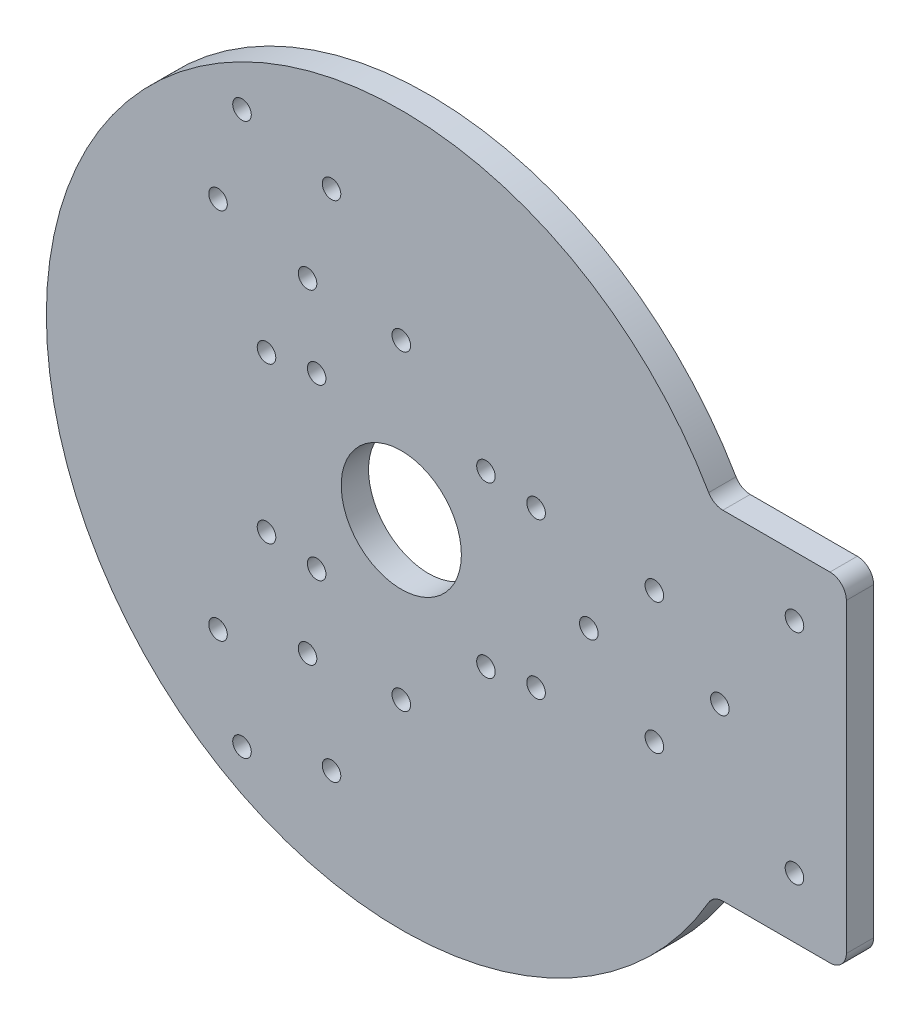
ISO-10303-21;
HEADER;
FILE_DESCRIPTION(('STEP AP214'),'2;1');
FILE_NAME('part.step','',(''),(''),'','','');
FILE_SCHEMA(('AUTOMOTIVE_DESIGN { 1 0 10303 214 1 1 1 1 }'));
ENDSEC;
DATA;
#1=APPLICATION_CONTEXT('core data for automotive mechanical design processes');
#2=APPLICATION_PROTOCOL_DEFINITION('international standard','automotive_design',2000,#1);
#3=PRODUCT_CONTEXT('',#1,'mechanical');
#4=PRODUCT('Part','Part','',(#3));
#5=PRODUCT_RELATED_PRODUCT_CATEGORY('part','',(#4));
#6=PRODUCT_DEFINITION_FORMATION('','',#4);
#7=PRODUCT_DEFINITION_CONTEXT('part definition',#1,'design');
#8=PRODUCT_DEFINITION('design','',#6,#7);
#9=PRODUCT_DEFINITION_SHAPE('','',#8);
#10=(LENGTH_UNIT() NAMED_UNIT(*) SI_UNIT(.MILLI.,.METRE.));
#11=(NAMED_UNIT(*) PLANE_ANGLE_UNIT() SI_UNIT($,.RADIAN.));
#12=(NAMED_UNIT(*) SI_UNIT($,.STERADIAN.) SOLID_ANGLE_UNIT());
#13=UNCERTAINTY_MEASURE_WITH_UNIT(LENGTH_MEASURE(1.E-05),#10,'distance_accuracy_value','');
#14=(GEOMETRIC_REPRESENTATION_CONTEXT(3) GLOBAL_UNCERTAINTY_ASSIGNED_CONTEXT((#13)) GLOBAL_UNIT_ASSIGNED_CONTEXT((#10,
#11,#12)) REPRESENTATION_CONTEXT('',''));
#15=CARTESIAN_POINT('',(0.,0.,0.));
#16=DIRECTION('',(0.,0.,1.));
#17=DIRECTION('',(1.,0.,0.));
#18=AXIS2_PLACEMENT_3D('',#15,#16,#17);
#19=CARTESIAN_POINT('',(78.5,-28.,5.));
#20=DIRECTION('',(0.,0.,-1.));
#21=DIRECTION('',(-1.,0.,0.));
#22=AXIS2_PLACEMENT_3D('',#19,#20,#21);
#23=CYLINDRICAL_SURFACE('',#22,3.);
#24=CARTESIAN_POINT('',(78.5,-28.,0.));
#25=DIRECTION('',(0.,0.,1.));
#26=DIRECTION('',(1.,0.,0.));
#27=AXIS2_PLACEMENT_3D('',#24,#25,#26);
#28=CIRCLE('',#27,3.);
#29=CARTESIAN_POINT('',(78.5,-31.,0.));
#30=VERTEX_POINT('',#29);
#31=CARTESIAN_POINT('',(81.5,-28.,0.));
#32=VERTEX_POINT('',#31);
#33=EDGE_CURVE('E133',#30,#32,#28,.T.);
#34=ORIENTED_EDGE('',*,*,#33,.T.);
#35=DIRECTION('',(0.,0.,-1.));
#36=VECTOR('',#35,1.);
#37=CARTESIAN_POINT('',(81.5,-28.,5.));
#38=LINE('',#37,#36);
#39=CARTESIAN_POINT('',(81.5,-28.,5.));
#40=VERTEX_POINT('',#39);
#41=EDGE_CURVE('E11',#40,#32,#38,.T.);
#42=ORIENTED_EDGE('',*,*,#41,.F.);
#43=CARTESIAN_POINT('',(78.5,-28.,5.));
#44=DIRECTION('',(0.,0.,1.));
#45=DIRECTION('',(1.,0.,0.));
#46=AXIS2_PLACEMENT_3D('',#43,#44,#45);
#47=CIRCLE('',#46,3.);
#48=CARTESIAN_POINT('',(78.5,-31.,5.));
#49=VERTEX_POINT('',#48);
#50=EDGE_CURVE('E148',#49,#40,#47,.T.);
#51=ORIENTED_EDGE('',*,*,#50,.F.);
#52=DIRECTION('',(0.,0.,-1.));
#53=VECTOR('',#52,1.);
#54=CARTESIAN_POINT('',(78.5,-31.,5.));
#55=LINE('',#54,#53);
#56=EDGE_CURVE('E129',#49,#30,#55,.T.);
#57=ORIENTED_EDGE('',*,*,#56,.T.);
#58=EDGE_LOOP('',(#34,#42,#51,#57));
#59=FACE_BOUND('',#58,.T.);
#60=ADVANCED_FACE('F35',(#59),#23,.T.);
#61=CARTESIAN_POINT('',(81.5,-28.,5.));
#62=DIRECTION('',(-1.,0.,0.));
#63=DIRECTION('',(0.,0.,1.));
#64=AXIS2_PLACEMENT_3D('',#61,#62,#63);
#65=PLANE('',#64);
#66=DIRECTION('',(0.,1.,0.));
#67=VECTOR('',#66,1.);
#68=CARTESIAN_POINT('',(81.5,-28.,0.));
#69=LINE('',#68,#67);
#70=CARTESIAN_POINT('',(81.5,28.,0.));
#71=VERTEX_POINT('',#70);
#72=EDGE_CURVE('E136',#32,#71,#69,.T.);
#73=ORIENTED_EDGE('',*,*,#72,.T.);
#74=DIRECTION('',(0.,0.,-1.));
#75=VECTOR('',#74,1.);
#76=CARTESIAN_POINT('',(81.5,28.,5.));
#77=LINE('',#76,#75);
#78=CARTESIAN_POINT('',(81.5,28.,5.));
#79=VERTEX_POINT('',#78);
#80=EDGE_CURVE('E44',#79,#71,#77,.T.);
#81=ORIENTED_EDGE('',*,*,#80,.F.);
#82=DIRECTION('',(0.,1.,0.));
#83=VECTOR('',#82,1.);
#84=CARTESIAN_POINT('',(81.5,-28.,5.));
#85=LINE('',#84,#83);
#86=EDGE_CURVE('E96',#40,#79,#85,.T.);
#87=ORIENTED_EDGE('',*,*,#86,.F.);
#88=ORIENTED_EDGE('',*,*,#41,.T.);
#89=EDGE_LOOP('',(#73,#81,#87,#88));
#90=FACE_BOUND('',#89,.T.);
#91=ADVANCED_FACE('F320',(#90),#65,.F.);
#92=CARTESIAN_POINT('',(78.5,28.,5.));
#93=DIRECTION('',(0.,0.,-1.));
#94=DIRECTION('',(-1.,0.,0.));
#95=AXIS2_PLACEMENT_3D('',#92,#93,#94);
#96=CYLINDRICAL_SURFACE('',#95,3.);
#97=CARTESIAN_POINT('',(78.5,28.,0.));
#98=DIRECTION('',(0.,0.,1.));
#99=DIRECTION('',(1.,0.,0.));
#100=AXIS2_PLACEMENT_3D('',#97,#98,#99);
#101=CIRCLE('',#100,3.);
#102=CARTESIAN_POINT('',(78.5,31.,0.));
#103=VERTEX_POINT('',#102);
#104=EDGE_CURVE('E139',#71,#103,#101,.T.);
#105=ORIENTED_EDGE('',*,*,#104,.T.);
#106=DIRECTION('',(0.,0.,-1.));
#107=VECTOR('',#106,1.);
#108=CARTESIAN_POINT('',(78.5,31.,5.));
#109=LINE('',#108,#107);
#110=CARTESIAN_POINT('',(78.5,31.,5.));
#111=VERTEX_POINT('',#110);
#112=EDGE_CURVE('E155',#111,#103,#109,.T.);
#113=ORIENTED_EDGE('',*,*,#112,.F.);
#114=CARTESIAN_POINT('',(78.5,28.,5.));
#115=DIRECTION('',(0.,0.,1.));
#116=DIRECTION('',(1.,0.,0.));
#117=AXIS2_PLACEMENT_3D('',#114,#115,#116);
#118=CIRCLE('',#117,3.);
#119=EDGE_CURVE('E288',#79,#111,#118,.T.);
#120=ORIENTED_EDGE('',*,*,#119,.F.);
#121=ORIENTED_EDGE('',*,*,#80,.T.);
#122=EDGE_LOOP('',(#105,#113,#120,#121));
#123=FACE_BOUND('',#122,.T.);
#124=ADVANCED_FACE('F324',(#123),#96,.T.);
#125=CARTESIAN_POINT('',(78.5,31.,5.));
#126=DIRECTION('',(0.,-1.,0.));
#127=DIRECTION('',(0.,0.,-1.));
#128=AXIS2_PLACEMENT_3D('',#125,#126,#127);
#129=PLANE('',#128);
#130=DIRECTION('',(-1.,0.,0.));
#131=VECTOR('',#130,1.);
#132=CARTESIAN_POINT('',(78.5,31.,0.));
#133=LINE('',#132,#131);
#134=CARTESIAN_POINT('',(58.8897274573418,31.,0.));
#135=VERTEX_POINT('',#134);
#136=EDGE_CURVE('E141',#103,#135,#133,.T.);
#137=ORIENTED_EDGE('',*,*,#136,.T.);
#138=DIRECTION('',(0.,0.,-1.));
#139=VECTOR('',#138,1.);
#140=CARTESIAN_POINT('',(58.8897274573418,31.,5.));
#141=LINE('',#140,#139);
#142=CARTESIAN_POINT('',(58.8897274573418,31.,5.));
#143=VERTEX_POINT('',#142);
#144=EDGE_CURVE('E152',#143,#135,#141,.T.);
#145=ORIENTED_EDGE('',*,*,#144,.F.);
#146=DIRECTION('',(-1.,0.,0.));
#147=VECTOR('',#146,1.);
#148=CARTESIAN_POINT('',(78.5,31.,5.));
#149=LINE('',#148,#147);
#150=EDGE_CURVE('E290',#111,#143,#149,.T.);
#151=ORIENTED_EDGE('',*,*,#150,.F.);
#152=ORIENTED_EDGE('',*,*,#112,.T.);
#153=EDGE_LOOP('',(#137,#145,#151,#152));
#154=FACE_BOUND('',#153,.T.);
#155=ADVANCED_FACE('F296',(#154),#129,.F.);
#156=CARTESIAN_POINT('',(58.8897274573418,34.,5.));
#157=DIRECTION('',(0.,0.,-1.));
#158=DIRECTION('',(-1.,0.,0.));
#159=AXIS2_PLACEMENT_3D('',#156,#157,#158);
#160=CYLINDRICAL_SURFACE('',#159,3.);
#161=CARTESIAN_POINT('',(58.8897274573418,34.,0.));
#162=DIRECTION('',(0.,0.,-1.));
#163=DIRECTION('',(-1.,0.,0.));
#164=AXIS2_PLACEMENT_3D('',#161,#162,#163);
#165=CIRCLE('',#164,3.);
#166=CARTESIAN_POINT('',(56.2916512459885,32.5,0.));
#167=VERTEX_POINT('',#166);
#168=EDGE_CURVE('E143',#135,#167,#165,.T.);
#169=ORIENTED_EDGE('',*,*,#168,.T.);
#170=DIRECTION('',(0.,0.,-1.));
#171=VECTOR('',#170,1.);
#172=CARTESIAN_POINT('',(56.2916512459885,32.5,5.));
#173=LINE('',#172,#171);
#174=CARTESIAN_POINT('',(56.2916512459885,32.5,5.));
#175=VERTEX_POINT('',#174);
#176=EDGE_CURVE('E124',#175,#167,#173,.T.);
#177=ORIENTED_EDGE('',*,*,#176,.F.);
#178=CARTESIAN_POINT('',(58.8897274573418,34.,5.));
#179=DIRECTION('',(0.,0.,-1.));
#180=DIRECTION('',(-1.,0.,0.));
#181=AXIS2_PLACEMENT_3D('',#178,#179,#180);
#182=CIRCLE('',#181,3.);
#183=EDGE_CURVE('E115',#143,#175,#182,.T.);
#184=ORIENTED_EDGE('',*,*,#183,.F.);
#185=ORIENTED_EDGE('',*,*,#144,.T.);
#186=EDGE_LOOP('',(#169,#177,#184,#185));
#187=FACE_BOUND('',#186,.T.);
#188=ADVANCED_FACE('F300',(#187),#160,.F.);
#189=CARTESIAN_POINT('',(0.,0.,5.));
#190=DIRECTION('',(0.,0.,-1.));
#191=DIRECTION('',(-1.,0.,0.));
#192=AXIS2_PLACEMENT_3D('',#189,#190,#191);
#193=CYLINDRICAL_SURFACE('',#192,65.);
#194=CARTESIAN_POINT('',(0.,0.,0.));
#195=DIRECTION('',(0.,0.,1.));
#196=DIRECTION('',(1.,0.,0.));
#197=AXIS2_PLACEMENT_3D('',#194,#195,#196);
#198=CIRCLE('',#197,65.);
#199=CARTESIAN_POINT('',(56.2916512459885,-32.5,0.));
#200=VERTEX_POINT('',#199);
#201=EDGE_CURVE('E123',#167,#200,#198,.T.);
#202=ORIENTED_EDGE('',*,*,#201,.T.);
#203=DIRECTION('',(0.,0.,-1.));
#204=VECTOR('',#203,1.);
#205=CARTESIAN_POINT('',(56.2916512459885,-32.5,5.));
#206=LINE('',#205,#204);
#207=CARTESIAN_POINT('',(56.2916512459885,-32.5,5.));
#208=VERTEX_POINT('',#207);
#209=EDGE_CURVE('E120',#208,#200,#206,.T.);
#210=ORIENTED_EDGE('',*,*,#209,.F.);
#211=CARTESIAN_POINT('',(0.,0.,5.));
#212=DIRECTION('',(0.,0.,1.));
#213=DIRECTION('',(1.,0.,0.));
#214=AXIS2_PLACEMENT_3D('',#211,#212,#213);
#215=CIRCLE('',#214,65.);
#216=EDGE_CURVE('E109',#175,#208,#215,.T.);
#217=ORIENTED_EDGE('',*,*,#216,.F.);
#218=ORIENTED_EDGE('',*,*,#176,.T.);
#219=EDGE_LOOP('',(#202,#210,#217,#218));
#220=FACE_BOUND('',#219,.T.);
#221=ADVANCED_FACE('F121',(#220),#193,.T.);
#222=CARTESIAN_POINT('',(58.8897274573418,-34.,5.));
#223=DIRECTION('',(0.,0.,-1.));
#224=DIRECTION('',(-1.,0.,0.));
#225=AXIS2_PLACEMENT_3D('',#222,#223,#224);
#226=CYLINDRICAL_SURFACE('',#225,3.);
#227=CARTESIAN_POINT('',(58.8897274573418,-34.,0.));
#228=DIRECTION('',(0.,0.,-1.));
#229=DIRECTION('',(1.,0.,0.));
#230=AXIS2_PLACEMENT_3D('',#227,#228,#229);
#231=CIRCLE('',#230,3.);
#232=CARTESIAN_POINT('',(58.8897274573418,-31.,0.));
#233=VERTEX_POINT('',#232);
#234=EDGE_CURVE('E82',#200,#233,#231,.T.);
#235=ORIENTED_EDGE('',*,*,#234,.T.);
#236=DIRECTION('',(0.,0.,-1.));
#237=VECTOR('',#236,1.);
#238=CARTESIAN_POINT('',(58.8897274573418,-31.,5.));
#239=LINE('',#238,#237);
#240=CARTESIAN_POINT('',(58.8897274573418,-31.,5.));
#241=VERTEX_POINT('',#240);
#242=EDGE_CURVE('E125',#241,#233,#239,.T.);
#243=ORIENTED_EDGE('',*,*,#242,.F.);
#244=CARTESIAN_POINT('',(58.8897274573418,-34.,5.));
#245=DIRECTION('',(0.,0.,-1.));
#246=DIRECTION('',(1.,0.,0.));
#247=AXIS2_PLACEMENT_3D('',#244,#245,#246);
#248=CIRCLE('',#247,3.);
#249=EDGE_CURVE('E113',#208,#241,#248,.T.);
#250=ORIENTED_EDGE('',*,*,#249,.F.);
#251=ORIENTED_EDGE('',*,*,#209,.T.);
#252=EDGE_LOOP('',(#235,#243,#250,#251));
#253=FACE_BOUND('',#252,.T.);
#254=ADVANCED_FACE('F127',(#253),#226,.F.);
#255=CARTESIAN_POINT('',(78.5,-31.,5.));
#256=DIRECTION('',(0.,1.,0.));
#257=DIRECTION('',(0.,0.,1.));
#258=AXIS2_PLACEMENT_3D('',#255,#256,#257);
#259=PLANE('',#258);
#260=DIRECTION('',(1.,0.,0.));
#261=VECTOR('',#260,1.);
#262=CARTESIAN_POINT('',(78.5,-31.,0.));
#263=LINE('',#262,#261);
#264=EDGE_CURVE('E88',#233,#30,#263,.T.);
#265=ORIENTED_EDGE('',*,*,#264,.T.);
#266=ORIENTED_EDGE('',*,*,#56,.F.);
#267=DIRECTION('',(1.,0.,0.));
#268=VECTOR('',#267,1.);
#269=CARTESIAN_POINT('',(78.5,-31.,5.));
#270=LINE('',#269,#268);
#271=EDGE_CURVE('E53',#241,#49,#270,.T.);
#272=ORIENTED_EDGE('',*,*,#271,.F.);
#273=ORIENTED_EDGE('',*,*,#242,.T.);
#274=EDGE_LOOP('',(#265,#266,#272,#273));
#275=FACE_BOUND('',#274,.T.);
#276=ADVANCED_FACE('F308',(#275),#259,.F.);
#277=CARTESIAN_POINT('',(78.5,-28.,5.));
#278=DIRECTION('',(0.,0.,1.));
#279=DIRECTION('',(1.,0.,0.));
#280=AXIS2_PLACEMENT_3D('',#277,#278,#279);
#281=PLANE('',#280);
#282=CARTESIAN_POINT('',(0.,28.5,5.));
#283=DIRECTION('',(0.,0.,1.));
#284=DIRECTION('',(1.,0.,0.));
#285=AXIS2_PLACEMENT_3D('',#282,#283,#284);
#286=CIRCLE('',#285,1.7);
#287=CARTESIAN_POINT('',(1.7,28.5,5.));
#288=VERTEX_POINT('',#287);
#289=EDGE_CURVE('E187',#288,#288,#286,.T.);
#290=ORIENTED_EDGE('',*,*,#289,.F.);
#291=EDGE_LOOP('',(#290));
#292=FACE_BOUND('',#291,.T.);
#293=CARTESIAN_POINT('',(-24.6817240078559,14.2499999999989,5.));
#294=DIRECTION('',(0.,0.,1.));
#295=DIRECTION('',(1.,0.,0.));
#296=AXIS2_PLACEMENT_3D('',#293,#294,#295);
#297=CIRCLE('',#296,1.70000000000122);
#298=CARTESIAN_POINT('',(-22.9817240078547,14.2499999999989,5.));
#299=VERTEX_POINT('',#298);
#300=EDGE_CURVE('E623',#299,#299,#297,.T.);
#301=ORIENTED_EDGE('',*,*,#300,.F.);
#302=EDGE_LOOP('',(#301));
#303=FACE_BOUND('',#302,.T.);
#304=CARTESIAN_POINT('',(-24.6817240078547,-14.2500000000011,5.));
#305=DIRECTION('',(0.,0.,1.));
#306=DIRECTION('',(1.,0.,0.));
#307=AXIS2_PLACEMENT_3D('',#304,#305,#306);
#308=CIRCLE('',#307,1.7000000000023);
#309=CARTESIAN_POINT('',(-22.9817240078524,-14.2500000000011,5.));
#310=VERTEX_POINT('',#309);
#311=EDGE_CURVE('E625',#310,#310,#308,.T.);
#312=ORIENTED_EDGE('',*,*,#311,.F.);
#313=EDGE_LOOP('',(#312));
#314=FACE_BOUND('',#313,.T.);
#315=CARTESIAN_POINT('',(2.41958542616683E-12,-28.5,5.));
#316=DIRECTION('',(0.,0.,1.));
#317=DIRECTION('',(1.,0.,0.));
#318=AXIS2_PLACEMENT_3D('',#315,#316,#317);
#319=CIRCLE('',#318,1.7000000000025);
#320=CARTESIAN_POINT('',(1.70000000000492,-28.5,5.));
#321=VERTEX_POINT('',#320);
#322=EDGE_CURVE('E629',#321,#321,#319,.T.);
#323=ORIENTED_EDGE('',*,*,#322,.F.);
#324=EDGE_LOOP('',(#323));
#325=FACE_BOUND('',#324,.T.);
#326=CARTESIAN_POINT('',(24.6817240078583,-14.2499999999989,5.));
#327=DIRECTION('',(0.,0.,1.));
#328=DIRECTION('',(1.,0.,0.));
#329=AXIS2_PLACEMENT_3D('',#326,#327,#328);
#330=CIRCLE('',#329,1.70000000000156);
#331=CARTESIAN_POINT('',(26.3817240078599,-14.2499999999989,5.));
#332=VERTEX_POINT('',#331);
#333=EDGE_CURVE('E620',#332,#332,#330,.T.);
#334=ORIENTED_EDGE('',*,*,#333,.F.);
#335=EDGE_LOOP('',(#334));
#336=FACE_BOUND('',#335,.T.);
#337=CARTESIAN_POINT('',(24.6817240078571,14.2500000000011,5.));
#338=DIRECTION('',(0.,0.,1.));
#339=DIRECTION('',(1.,0.,0.));
#340=AXIS2_PLACEMENT_3D('',#337,#338,#339);
#341=CIRCLE('',#340,1.70000000000034);
#342=CARTESIAN_POINT('',(26.3817240078574,14.2500000000011,5.));
#343=VERTEX_POINT('',#342);
#344=EDGE_CURVE('E617',#343,#343,#341,.T.);
#345=ORIENTED_EDGE('',*,*,#344,.F.);
#346=EDGE_LOOP('',(#345));
#347=FACE_BOUND('',#346,.T.);
#348=CARTESIAN_POINT('',(72.,-20.,5.));
#349=DIRECTION('',(0.,0.,1.));
#350=DIRECTION('',(-1.,0.,0.));
#351=AXIS2_PLACEMENT_3D('',#348,#349,#350);
#352=CIRCLE('',#351,1.7);
#353=CARTESIAN_POINT('',(70.3,-20.,5.));
#354=VERTEX_POINT('',#353);
#355=EDGE_CURVE('E200',#354,#354,#352,.T.);
#356=ORIENTED_EDGE('',*,*,#355,.F.);
#357=EDGE_LOOP('',(#356));
#358=FACE_BOUND('',#357,.T.);
#359=CARTESIAN_POINT('',(72.,20.,5.));
#360=DIRECTION('',(0.,0.,1.));
#361=DIRECTION('',(1.,0.,0.));
#362=AXIS2_PLACEMENT_3D('',#359,#360,#361);
#363=CIRCLE('',#362,1.7);
#364=CARTESIAN_POINT('',(73.7,20.,5.));
#365=VERTEX_POINT('',#364);
#366=EDGE_CURVE('E204',#365,#365,#363,.T.);
#367=ORIENTED_EDGE('',*,*,#366,.F.);
#368=EDGE_LOOP('',(#367));
#369=FACE_BOUND('',#368,.T.);
#370=CARTESIAN_POINT('',(-15.5,-15.5,5.));
#371=DIRECTION('',(0.,0.,1.));
#372=DIRECTION('',(1.,0.,0.));
#373=AXIS2_PLACEMENT_3D('',#370,#371,#372);
#374=CIRCLE('',#373,1.7);
#375=CARTESIAN_POINT('',(-13.8,-15.5,5.));
#376=VERTEX_POINT('',#375);
#377=EDGE_CURVE('E209',#376,#376,#374,.T.);
#378=ORIENTED_EDGE('',*,*,#377,.F.);
#379=EDGE_LOOP('',(#378));
#380=FACE_BOUND('',#379,.T.);
#381=CARTESIAN_POINT('',(-15.5,15.5,5.));
#382=DIRECTION('',(0.,0.,1.));
#383=DIRECTION('',(1.,0.,0.));
#384=AXIS2_PLACEMENT_3D('',#381,#382,#383);
#385=CIRCLE('',#384,1.7);
#386=CARTESIAN_POINT('',(-13.8,15.5,5.));
#387=VERTEX_POINT('',#386);
#388=EDGE_CURVE('E639',#387,#387,#385,.T.);
#389=ORIENTED_EDGE('',*,*,#388,.F.);
#390=EDGE_LOOP('',(#389));
#391=FACE_BOUND('',#390,.T.);
#392=CARTESIAN_POINT('',(15.5,15.5,5.));
#393=DIRECTION('',(0.,0.,1.));
#394=DIRECTION('',(1.,0.,0.));
#395=AXIS2_PLACEMENT_3D('',#392,#393,#394);
#396=CIRCLE('',#395,1.7);
#397=CARTESIAN_POINT('',(17.2,15.5,5.));
#398=VERTEX_POINT('',#397);
#399=EDGE_CURVE('E636',#398,#398,#396,.T.);
#400=ORIENTED_EDGE('',*,*,#399,.F.);
#401=EDGE_LOOP('',(#400));
#402=FACE_BOUND('',#401,.T.);
#403=CARTESIAN_POINT('',(15.5,-15.5,5.));
#404=DIRECTION('',(0.,0.,1.));
#405=DIRECTION('',(1.,0.,0.));
#406=AXIS2_PLACEMENT_3D('',#403,#404,#405);
#407=CIRCLE('',#406,1.7);
#408=CARTESIAN_POINT('',(17.2,-15.5,5.));
#409=VERTEX_POINT('',#408);
#410=EDGE_CURVE('E215',#409,#409,#407,.T.);
#411=ORIENTED_EDGE('',*,*,#410,.F.);
#412=EDGE_LOOP('',(#411));
#413=FACE_BOUND('',#412,.T.);
#414=CARTESIAN_POINT('',(0.,0.,5.));
#415=DIRECTION('',(0.,0.,1.));
#416=DIRECTION('',(1.,0.,0.));
#417=AXIS2_PLACEMENT_3D('',#414,#415,#416);
#418=CIRCLE('',#417,11.);
#419=CARTESIAN_POINT('',(11.,0.,5.));
#420=VERTEX_POINT('',#419);
#421=EDGE_CURVE('E164',#420,#420,#418,.T.);
#422=ORIENTED_EDGE('',*,*,#421,.F.);
#423=EDGE_LOOP('',(#422));
#424=FACE_BOUND('',#423,.T.);
#425=CARTESIAN_POINT('',(-29.1700000000002,50.523922056784,5.));
#426=DIRECTION('',(0.,0.,1.));
#427=DIRECTION('',(-0.500000000000004,0.866025403784436,0.));
#428=AXIS2_PLACEMENT_3D('',#425,#426,#427);
#429=CIRCLE('',#428,1.7);
#430=CARTESIAN_POINT('',(-30.0200000000002,51.9961652432176,5.));
#431=VERTEX_POINT('',#430);
#432=EDGE_CURVE('E220',#431,#431,#429,.T.);
#433=ORIENTED_EDGE('',*,*,#432,.F.);
#434=EDGE_LOOP('',(#433));
#435=FACE_BOUND('',#434,.T.);
#436=CARTESIAN_POINT('',(-12.7776951545863,-46.131617211371,5.));
#437=DIRECTION('',(0.,0.,1.));
#438=DIRECTION('',(-0.499999999999992,-0.866025403784443,0.));
#439=AXIS2_PLACEMENT_3D('',#436,#437,#438);
#440=CIRCLE('',#439,1.7);
#441=CARTESIAN_POINT('',(-13.6276951545863,-47.6038603978046,5.));
#442=VERTEX_POINT('',#441);
#443=EDGE_CURVE('E182',#442,#442,#440,.T.);
#444=ORIENTED_EDGE('',*,*,#443,.F.);
#445=EDGE_LOOP('',(#444));
#446=FACE_BOUND('',#445,.T.);
#447=CARTESIAN_POINT('',(-17.1699999999997,-29.7393123659578,5.));
#448=DIRECTION('',(0.,0.,1.));
#449=DIRECTION('',(-0.499999999999992,-0.866025403784443,0.));
#450=AXIS2_PLACEMENT_3D('',#447,#448,#449);
#451=CIRCLE('',#450,1.7);
#452=CARTESIAN_POINT('',(-18.0199999999997,-31.2115555523913,5.));
#453=VERTEX_POINT('',#452);
#454=EDGE_CURVE('E234',#453,#453,#451,.T.);
#455=ORIENTED_EDGE('',*,*,#454,.F.);
#456=EDGE_LOOP('',(#455));
#457=FACE_BOUND('',#456,.T.);
#458=CARTESIAN_POINT('',(-33.5623048454129,-34.1316172113712,5.));
#459=DIRECTION('',(0.,0.,1.));
#460=DIRECTION('',(-0.499999999999992,-0.866025403784443,0.));
#461=AXIS2_PLACEMENT_3D('',#458,#459,#460);
#462=CIRCLE('',#461,1.7);
#463=CARTESIAN_POINT('',(-34.4123048454129,-35.6038603978048,5.));
#464=VERTEX_POINT('',#463);
#465=EDGE_CURVE('E228',#464,#464,#462,.T.);
#466=ORIENTED_EDGE('',*,*,#465,.F.);
#467=EDGE_LOOP('',(#466));
#468=FACE_BOUND('',#467,.T.);
#469=CARTESIAN_POINT('',(-29.1699999999995,-50.5239220567844,5.));
#470=DIRECTION('',(0.,0.,1.));
#471=DIRECTION('',(-0.499999999999992,-0.866025403784443,0.));
#472=AXIS2_PLACEMENT_3D('',#469,#470,#471);
#473=CIRCLE('',#472,1.7);
#474=CARTESIAN_POINT('',(-30.0199999999995,-51.996165243218,5.));
#475=VERTEX_POINT('',#474);
#476=EDGE_CURVE('E227',#475,#475,#473,.T.);
#477=ORIENTED_EDGE('',*,*,#476,.F.);
#478=EDGE_LOOP('',(#477));
#479=FACE_BOUND('',#478,.T.);
#480=CARTESIAN_POINT('',(-33.5623048454134,34.1316172113707,5.));
#481=DIRECTION('',(0.,0.,1.));
#482=DIRECTION('',(-0.500000000000004,0.866025403784436,0.));
#483=AXIS2_PLACEMENT_3D('',#480,#481,#482);
#484=CIRCLE('',#483,1.7);
#485=CARTESIAN_POINT('',(-34.4123048454134,35.6038603978043,5.));
#486=VERTEX_POINT('',#485);
#487=EDGE_CURVE('E256',#486,#486,#484,.T.);
#488=ORIENTED_EDGE('',*,*,#487,.F.);
#489=EDGE_LOOP('',(#488));
#490=FACE_BOUND('',#489,.T.);
#491=CARTESIAN_POINT('',(-17.1700000000001,29.7393123659575,5.));
#492=DIRECTION('',(0.,0.,1.));
#493=DIRECTION('',(-0.500000000000004,0.866025403784436,0.));
#494=AXIS2_PLACEMENT_3D('',#491,#492,#493);
#495=CIRCLE('',#494,1.7);
#496=CARTESIAN_POINT('',(-18.0200000000001,31.2115555523911,5.));
#497=VERTEX_POINT('',#496);
#498=EDGE_CURVE('E250',#497,#497,#495,.T.);
#499=ORIENTED_EDGE('',*,*,#498,.F.);
#500=EDGE_LOOP('',(#499));
#501=FACE_BOUND('',#500,.T.);
#502=CARTESIAN_POINT('',(-12.777695154587,46.1316172113708,5.));
#503=DIRECTION('',(0.,0.,1.));
#504=DIRECTION('',(-0.500000000000004,0.866025403784436,0.));
#505=AXIS2_PLACEMENT_3D('',#502,#503,#504);
#506=CIRCLE('',#505,1.7);
#507=CARTESIAN_POINT('',(-13.627695154587,47.6038603978044,5.));
#508=VERTEX_POINT('',#507);
#509=EDGE_CURVE('E244',#508,#508,#506,.T.);
#510=ORIENTED_EDGE('',*,*,#509,.F.);
#511=EDGE_LOOP('',(#510));
#512=FACE_BOUND('',#511,.T.);
#513=CARTESIAN_POINT('',(58.34,0.,5.));
#514=DIRECTION('',(0.,0.,1.));
#515=DIRECTION('',(1.,0.,0.));
#516=AXIS2_PLACEMENT_3D('',#513,#514,#515);
#517=CIRCLE('',#516,1.7);
#518=CARTESIAN_POINT('',(60.04,0.,5.));
#519=VERTEX_POINT('',#518);
#520=EDGE_CURVE('E266',#519,#519,#517,.T.);
#521=ORIENTED_EDGE('',*,*,#520,.F.);
#522=EDGE_LOOP('',(#521));
#523=FACE_BOUND('',#522,.T.);
#524=CARTESIAN_POINT('',(46.34,-12.,5.));
#525=DIRECTION('',(0.,0.,1.));
#526=DIRECTION('',(1.,0.,0.));
#527=AXIS2_PLACEMENT_3D('',#524,#525,#526);
#528=CIRCLE('',#527,1.7);
#529=CARTESIAN_POINT('',(48.04,-12.,5.));
#530=VERTEX_POINT('',#529);
#531=EDGE_CURVE('E272',#530,#530,#528,.T.);
#532=ORIENTED_EDGE('',*,*,#531,.F.);
#533=EDGE_LOOP('',(#532));
#534=FACE_BOUND('',#533,.T.);
#535=CARTESIAN_POINT('',(34.34,0.,5.));
#536=DIRECTION('',(0.,0.,1.));
#537=DIRECTION('',(1.,0.,0.));
#538=AXIS2_PLACEMENT_3D('',#535,#536,#537);
#539=CIRCLE('',#538,1.7);
#540=CARTESIAN_POINT('',(36.04,0.,5.));
#541=VERTEX_POINT('',#540);
#542=EDGE_CURVE('E278',#541,#541,#539,.T.);
#543=ORIENTED_EDGE('',*,*,#542,.F.);
#544=EDGE_LOOP('',(#543));
#545=FACE_BOUND('',#544,.T.);
#546=CARTESIAN_POINT('',(46.34,12.,5.));
#547=DIRECTION('',(0.,0.,1.));
#548=DIRECTION('',(1.,0.,0.));
#549=AXIS2_PLACEMENT_3D('',#546,#547,#548);
#550=CIRCLE('',#549,1.7);
#551=CARTESIAN_POINT('',(48.04,12.,5.));
#552=VERTEX_POINT('',#551);
#553=EDGE_CURVE('E219',#552,#552,#550,.T.);
#554=ORIENTED_EDGE('',*,*,#553,.F.);
#555=EDGE_LOOP('',(#554));
#556=FACE_BOUND('',#555,.T.);
#557=ORIENTED_EDGE('',*,*,#50,.T.);
#558=ORIENTED_EDGE('',*,*,#86,.T.);
#559=ORIENTED_EDGE('',*,*,#119,.T.);
#560=ORIENTED_EDGE('',*,*,#150,.T.);
#561=ORIENTED_EDGE('',*,*,#183,.T.);
#562=ORIENTED_EDGE('',*,*,#216,.T.);
#563=ORIENTED_EDGE('',*,*,#249,.T.);
#564=ORIENTED_EDGE('',*,*,#271,.T.);
#565=EDGE_LOOP('',(#557,#558,#559,#560,#561,#562,#563,#564));
#566=FACE_BOUND('',#565,.T.);
#567=ADVANCED_FACE('F111',(#292,#303,#314,#325,#336,#347,#358,#369,#380,#391,#402,#413,#424,
#435,#446,#457,#468,#479,#490,#501,#512,#523,#534,#545,#556,#566),#281,.T.);
#568=CARTESIAN_POINT('',(78.5,-28.,0.));
#569=DIRECTION('',(0.,0.,1.));
#570=DIRECTION('',(1.,0.,0.));
#571=AXIS2_PLACEMENT_3D('',#568,#569,#570);
#572=PLANE('',#571);
#573=CARTESIAN_POINT('',(0.,28.5,0.));
#574=DIRECTION('',(0.,0.,1.));
#575=DIRECTION('',(1.,0.,0.));
#576=AXIS2_PLACEMENT_3D('',#573,#574,#575);
#577=CIRCLE('',#576,1.7);
#578=CARTESIAN_POINT('',(1.7,28.5,0.));
#579=VERTEX_POINT('',#578);
#580=EDGE_CURVE('E38',#579,#579,#577,.T.);
#581=ORIENTED_EDGE('',*,*,#580,.T.);
#582=EDGE_LOOP('',(#581));
#583=FACE_BOUND('',#582,.T.);
#584=CARTESIAN_POINT('',(-24.6817240078559,14.2499999999989,0.));
#585=DIRECTION('',(0.,0.,1.));
#586=DIRECTION('',(1.,0.,0.));
#587=AXIS2_PLACEMENT_3D('',#584,#585,#586);
#588=CIRCLE('',#587,1.70000000000122);
#589=CARTESIAN_POINT('',(-22.9817240078547,14.2499999999989,0.));
#590=VERTEX_POINT('',#589);
#591=EDGE_CURVE('E195',#590,#590,#588,.T.);
#592=ORIENTED_EDGE('',*,*,#591,.T.);
#593=EDGE_LOOP('',(#592));
#594=FACE_BOUND('',#593,.T.);
#595=CARTESIAN_POINT('',(-24.6817240078547,-14.2500000000011,0.));
#596=DIRECTION('',(0.,0.,1.));
#597=DIRECTION('',(1.,0.,0.));
#598=AXIS2_PLACEMENT_3D('',#595,#596,#597);
#599=CIRCLE('',#598,1.7000000000023);
#600=CARTESIAN_POINT('',(-22.9817240078524,-14.2500000000011,0.));
#601=VERTEX_POINT('',#600);
#602=EDGE_CURVE('E193',#601,#601,#599,.T.);
#603=ORIENTED_EDGE('',*,*,#602,.T.);
#604=EDGE_LOOP('',(#603));
#605=FACE_BOUND('',#604,.T.);
#606=CARTESIAN_POINT('',(2.41958542616683E-12,-28.5,0.));
#607=DIRECTION('',(0.,0.,1.));
#608=DIRECTION('',(1.,0.,0.));
#609=AXIS2_PLACEMENT_3D('',#606,#607,#608);
#610=CIRCLE('',#609,1.7000000000025);
#611=CARTESIAN_POINT('',(1.70000000000492,-28.5,0.));
#612=VERTEX_POINT('',#611);
#613=EDGE_CURVE('E190',#612,#612,#610,.T.);
#614=ORIENTED_EDGE('',*,*,#613,.T.);
#615=EDGE_LOOP('',(#614));
#616=FACE_BOUND('',#615,.T.);
#617=CARTESIAN_POINT('',(24.6817240078583,-14.2499999999989,0.));
#618=DIRECTION('',(0.,0.,1.));
#619=DIRECTION('',(1.,0.,0.));
#620=AXIS2_PLACEMENT_3D('',#617,#618,#619);
#621=CIRCLE('',#620,1.70000000000156);
#622=CARTESIAN_POINT('',(26.3817240078599,-14.2499999999989,0.));
#623=VERTEX_POINT('',#622);
#624=EDGE_CURVE('E186',#623,#623,#621,.T.);
#625=ORIENTED_EDGE('',*,*,#624,.T.);
#626=EDGE_LOOP('',(#625));
#627=FACE_BOUND('',#626,.T.);
#628=CARTESIAN_POINT('',(24.6817240078571,14.2500000000011,0.));
#629=DIRECTION('',(0.,0.,1.));
#630=DIRECTION('',(1.,0.,0.));
#631=AXIS2_PLACEMENT_3D('',#628,#629,#630);
#632=CIRCLE('',#631,1.70000000000034);
#633=CARTESIAN_POINT('',(26.3817240078574,14.2500000000011,0.));
#634=VERTEX_POINT('',#633);
#635=EDGE_CURVE('E183',#634,#634,#632,.T.);
#636=ORIENTED_EDGE('',*,*,#635,.T.);
#637=EDGE_LOOP('',(#636));
#638=FACE_BOUND('',#637,.T.);
#639=CARTESIAN_POINT('',(72.,-20.,0.));
#640=DIRECTION('',(0.,0.,1.));
#641=DIRECTION('',(1.,0.,0.));
#642=AXIS2_PLACEMENT_3D('',#639,#640,#641);
#643=CIRCLE('',#642,1.7);
#644=CARTESIAN_POINT('',(73.7,-20.,0.));
#645=VERTEX_POINT('',#644);
#646=EDGE_CURVE('E179',#645,#645,#643,.T.);
#647=ORIENTED_EDGE('',*,*,#646,.T.);
#648=EDGE_LOOP('',(#647));
#649=FACE_BOUND('',#648,.T.);
#650=CARTESIAN_POINT('',(72.,20.,0.));
#651=DIRECTION('',(0.,0.,1.));
#652=DIRECTION('',(1.,0.,0.));
#653=AXIS2_PLACEMENT_3D('',#650,#651,#652);
#654=CIRCLE('',#653,1.7);
#655=CARTESIAN_POINT('',(73.7,20.,0.));
#656=VERTEX_POINT('',#655);
#657=EDGE_CURVE('E176',#656,#656,#654,.T.);
#658=ORIENTED_EDGE('',*,*,#657,.T.);
#659=EDGE_LOOP('',(#658));
#660=FACE_BOUND('',#659,.T.);
#661=CARTESIAN_POINT('',(-15.5,-15.5,0.));
#662=DIRECTION('',(0.,0.,1.));
#663=DIRECTION('',(1.,0.,0.));
#664=AXIS2_PLACEMENT_3D('',#661,#662,#663);
#665=CIRCLE('',#664,1.7);
#666=CARTESIAN_POINT('',(-13.8,-15.5,0.));
#667=VERTEX_POINT('',#666);
#668=EDGE_CURVE('E173',#667,#667,#665,.T.);
#669=ORIENTED_EDGE('',*,*,#668,.T.);
#670=EDGE_LOOP('',(#669));
#671=FACE_BOUND('',#670,.T.);
#672=CARTESIAN_POINT('',(-15.5,15.5,0.));
#673=DIRECTION('',(0.,0.,1.));
#674=DIRECTION('',(1.,0.,0.));
#675=AXIS2_PLACEMENT_3D('',#672,#673,#674);
#676=CIRCLE('',#675,1.7);
#677=CARTESIAN_POINT('',(-13.8,15.5,0.));
#678=VERTEX_POINT('',#677);
#679=EDGE_CURVE('E170',#678,#678,#676,.T.);
#680=ORIENTED_EDGE('',*,*,#679,.T.);
#681=EDGE_LOOP('',(#680));
#682=FACE_BOUND('',#681,.T.);
#683=CARTESIAN_POINT('',(15.5,15.5,0.));
#684=DIRECTION('',(0.,0.,1.));
#685=DIRECTION('',(1.,0.,0.));
#686=AXIS2_PLACEMENT_3D('',#683,#684,#685);
#687=CIRCLE('',#686,1.7);
#688=CARTESIAN_POINT('',(17.2,15.5,0.));
#689=VERTEX_POINT('',#688);
#690=EDGE_CURVE('E167',#689,#689,#687,.T.);
#691=ORIENTED_EDGE('',*,*,#690,.T.);
#692=EDGE_LOOP('',(#691));
#693=FACE_BOUND('',#692,.T.);
#694=CARTESIAN_POINT('',(15.5,-15.5,0.));
#695=DIRECTION('',(0.,0.,1.));
#696=DIRECTION('',(1.,0.,0.));
#697=AXIS2_PLACEMENT_3D('',#694,#695,#696);
#698=CIRCLE('',#697,1.7);
#699=CARTESIAN_POINT('',(17.2,-15.5,0.));
#700=VERTEX_POINT('',#699);
#701=EDGE_CURVE('E163',#700,#700,#698,.T.);
#702=ORIENTED_EDGE('',*,*,#701,.T.);
#703=EDGE_LOOP('',(#702));
#704=FACE_BOUND('',#703,.T.);
#705=CARTESIAN_POINT('',(0.,0.,0.));
#706=DIRECTION('',(0.,0.,1.));
#707=DIRECTION('',(1.,0.,0.));
#708=AXIS2_PLACEMENT_3D('',#705,#706,#707);
#709=CIRCLE('',#708,11.);
#710=CARTESIAN_POINT('',(11.,0.,0.));
#711=VERTEX_POINT('',#710);
#712=EDGE_CURVE('E160',#711,#711,#709,.T.);
#713=ORIENTED_EDGE('',*,*,#712,.T.);
#714=EDGE_LOOP('',(#713));
#715=FACE_BOUND('',#714,.T.);
#716=CARTESIAN_POINT('',(-29.1700000000002,50.523922056784,0.));
#717=DIRECTION('',(0.,0.,1.));
#718=DIRECTION('',(-0.500000000000004,0.866025403784436,0.));
#719=AXIS2_PLACEMENT_3D('',#716,#717,#718);
#720=CIRCLE('',#719,1.7);
#721=CARTESIAN_POINT('',(-30.0200000000002,51.9961652432176,0.));
#722=VERTEX_POINT('',#721);
#723=EDGE_CURVE('E216',#722,#722,#720,.T.);
#724=ORIENTED_EDGE('',*,*,#723,.T.);
#725=EDGE_LOOP('',(#724));
#726=FACE_BOUND('',#725,.T.);
#727=CARTESIAN_POINT('',(-12.7776951545863,-46.131617211371,0.));
#728=DIRECTION('',(0.,0.,1.));
#729=DIRECTION('',(-0.499999999999992,-0.866025403784443,0.));
#730=AXIS2_PLACEMENT_3D('',#727,#728,#729);
#731=CIRCLE('',#730,1.7);
#732=CARTESIAN_POINT('',(-13.6276951545863,-47.6038603978046,0.));
#733=VERTEX_POINT('',#732);
#734=EDGE_CURVE('E237',#733,#733,#731,.T.);
#735=ORIENTED_EDGE('',*,*,#734,.T.);
#736=EDGE_LOOP('',(#735));
#737=FACE_BOUND('',#736,.T.);
#738=CARTESIAN_POINT('',(-17.1699999999997,-29.7393123659578,0.));
#739=DIRECTION('',(0.,0.,1.));
#740=DIRECTION('',(-0.499999999999992,-0.866025403784443,0.));
#741=AXIS2_PLACEMENT_3D('',#738,#739,#740);
#742=CIRCLE('',#741,1.7);
#743=CARTESIAN_POINT('',(-18.0199999999997,-31.2115555523913,0.));
#744=VERTEX_POINT('',#743);
#745=EDGE_CURVE('E231',#744,#744,#742,.T.);
#746=ORIENTED_EDGE('',*,*,#745,.T.);
#747=EDGE_LOOP('',(#746));
#748=FACE_BOUND('',#747,.T.);
#749=CARTESIAN_POINT('',(-33.5623048454129,-34.1316172113712,0.));
#750=DIRECTION('',(0.,0.,1.));
#751=DIRECTION('',(-0.499999999999992,-0.866025403784443,0.));
#752=AXIS2_PLACEMENT_3D('',#749,#750,#751);
#753=CIRCLE('',#752,1.7);
#754=CARTESIAN_POINT('',(-34.4123048454129,-35.6038603978048,0.));
#755=VERTEX_POINT('',#754);
#756=EDGE_CURVE('E224',#755,#755,#753,.T.);
#757=ORIENTED_EDGE('',*,*,#756,.T.);
#758=EDGE_LOOP('',(#757));
#759=FACE_BOUND('',#758,.T.);
#760=CARTESIAN_POINT('',(-29.1699999999995,-50.5239220567844,0.));
#761=DIRECTION('',(0.,0.,1.));
#762=DIRECTION('',(-0.499999999999992,-0.866025403784443,0.));
#763=AXIS2_PLACEMENT_3D('',#760,#761,#762);
#764=CIRCLE('',#763,1.7);
#765=CARTESIAN_POINT('',(-30.0199999999995,-51.996165243218,0.));
#766=VERTEX_POINT('',#765);
#767=EDGE_CURVE('E259',#766,#766,#764,.T.);
#768=ORIENTED_EDGE('',*,*,#767,.T.);
#769=EDGE_LOOP('',(#768));
#770=FACE_BOUND('',#769,.T.);
#771=CARTESIAN_POINT('',(-33.5623048454134,34.1316172113707,0.));
#772=DIRECTION('',(0.,0.,1.));
#773=DIRECTION('',(-0.500000000000004,0.866025403784436,0.));
#774=AXIS2_PLACEMENT_3D('',#771,#772,#773);
#775=CIRCLE('',#774,1.7);
#776=CARTESIAN_POINT('',(-34.4123048454134,35.6038603978043,0.));
#777=VERTEX_POINT('',#776);
#778=EDGE_CURVE('E253',#777,#777,#775,.T.);
#779=ORIENTED_EDGE('',*,*,#778,.T.);
#780=EDGE_LOOP('',(#779));
#781=FACE_BOUND('',#780,.T.);
#782=CARTESIAN_POINT('',(-17.1700000000001,29.7393123659575,0.));
#783=DIRECTION('',(0.,0.,1.));
#784=DIRECTION('',(-0.500000000000004,0.866025403784436,0.));
#785=AXIS2_PLACEMENT_3D('',#782,#783,#784);
#786=CIRCLE('',#785,1.7);
#787=CARTESIAN_POINT('',(-18.0200000000001,31.2115555523911,0.));
#788=VERTEX_POINT('',#787);
#789=EDGE_CURVE('E247',#788,#788,#786,.T.);
#790=ORIENTED_EDGE('',*,*,#789,.T.);
#791=EDGE_LOOP('',(#790));
#792=FACE_BOUND('',#791,.T.);
#793=CARTESIAN_POINT('',(-12.777695154587,46.1316172113708,0.));
#794=DIRECTION('',(0.,0.,1.));
#795=DIRECTION('',(-0.500000000000004,0.866025403784436,0.));
#796=AXIS2_PLACEMENT_3D('',#793,#794,#795);
#797=CIRCLE('',#796,1.7);
#798=CARTESIAN_POINT('',(-13.627695154587,47.6038603978044,0.));
#799=VERTEX_POINT('',#798);
#800=EDGE_CURVE('E223',#799,#799,#797,.T.);
#801=ORIENTED_EDGE('',*,*,#800,.T.);
#802=EDGE_LOOP('',(#801));
#803=FACE_BOUND('',#802,.T.);
#804=CARTESIAN_POINT('',(58.34,0.,0.));
#805=DIRECTION('',(0.,0.,1.));
#806=DIRECTION('',(1.,0.,0.));
#807=AXIS2_PLACEMENT_3D('',#804,#805,#806);
#808=CIRCLE('',#807,1.7);
#809=CARTESIAN_POINT('',(60.04,0.,0.));
#810=VERTEX_POINT('',#809);
#811=EDGE_CURVE('E137',#810,#810,#808,.T.);
#812=ORIENTED_EDGE('',*,*,#811,.T.);
#813=EDGE_LOOP('',(#812));
#814=FACE_BOUND('',#813,.T.);
#815=CARTESIAN_POINT('',(46.34,-12.,0.));
#816=DIRECTION('',(0.,0.,1.));
#817=DIRECTION('',(1.,0.,0.));
#818=AXIS2_PLACEMENT_3D('',#815,#816,#817);
#819=CIRCLE('',#818,1.7);
#820=CARTESIAN_POINT('',(48.04,-12.,0.));
#821=VERTEX_POINT('',#820);
#822=EDGE_CURVE('E269',#821,#821,#819,.T.);
#823=ORIENTED_EDGE('',*,*,#822,.T.);
#824=EDGE_LOOP('',(#823));
#825=FACE_BOUND('',#824,.T.);
#826=CARTESIAN_POINT('',(34.34,0.,0.));
#827=DIRECTION('',(0.,0.,1.));
#828=DIRECTION('',(1.,0.,0.));
#829=AXIS2_PLACEMENT_3D('',#826,#827,#828);
#830=CIRCLE('',#829,1.7);
#831=CARTESIAN_POINT('',(36.04,0.,0.));
#832=VERTEX_POINT('',#831);
#833=EDGE_CURVE('E275',#832,#832,#830,.T.);
#834=ORIENTED_EDGE('',*,*,#833,.T.);
#835=EDGE_LOOP('',(#834));
#836=FACE_BOUND('',#835,.T.);
#837=CARTESIAN_POINT('',(46.34,12.,0.));
#838=DIRECTION('',(0.,0.,1.));
#839=DIRECTION('',(1.,0.,0.));
#840=AXIS2_PLACEMENT_3D('',#837,#838,#839);
#841=CIRCLE('',#840,1.7);
#842=CARTESIAN_POINT('',(48.04,12.,0.));
#843=VERTEX_POINT('',#842);
#844=EDGE_CURVE('E281',#843,#843,#841,.T.);
#845=ORIENTED_EDGE('',*,*,#844,.T.);
#846=EDGE_LOOP('',(#845));
#847=FACE_BOUND('',#846,.T.);
#848=ORIENTED_EDGE('',*,*,#33,.F.);
#849=ORIENTED_EDGE('',*,*,#264,.F.);
#850=ORIENTED_EDGE('',*,*,#234,.F.);
#851=ORIENTED_EDGE('',*,*,#201,.F.);
#852=ORIENTED_EDGE('',*,*,#168,.F.);
#853=ORIENTED_EDGE('',*,*,#136,.F.);
#854=ORIENTED_EDGE('',*,*,#104,.F.);
#855=ORIENTED_EDGE('',*,*,#72,.F.);
#856=EDGE_LOOP('',(#848,#849,#850,#851,#852,#853,#854,#855));
#857=FACE_BOUND('',#856,.T.);
#858=ADVANCED_FACE('F303',(#583,#594,#605,#616,#627,#638,#649,#660,#671,#682,#693,#704,#715,
#726,#737,#748,#759,#770,#781,#792,#803,#814,#825,#836,#847,#857),#572,.F.);
#859=CARTESIAN_POINT('',(46.34,12.,0.));
#860=DIRECTION('',(0.,0.,1.));
#861=DIRECTION('',(1.,0.,0.));
#862=AXIS2_PLACEMENT_3D('',#859,#860,#861);
#863=CYLINDRICAL_SURFACE('',#862,1.7);
#864=ORIENTED_EDGE('',*,*,#844,.F.);
#865=EDGE_LOOP('',(#864));
#866=FACE_BOUND('',#865,.T.);
#867=ORIENTED_EDGE('',*,*,#553,.T.);
#868=EDGE_LOOP('',(#867));
#869=FACE_BOUND('',#868,.T.);
#870=ADVANCED_FACE('F354',(#866,#869),#863,.F.);
#871=CARTESIAN_POINT('',(34.34,0.,0.));
#872=DIRECTION('',(0.,0.,1.));
#873=DIRECTION('',(1.,0.,0.));
#874=AXIS2_PLACEMENT_3D('',#871,#872,#873);
#875=CYLINDRICAL_SURFACE('',#874,1.7);
#876=ORIENTED_EDGE('',*,*,#833,.F.);
#877=EDGE_LOOP('',(#876));
#878=FACE_BOUND('',#877,.T.);
#879=ORIENTED_EDGE('',*,*,#542,.T.);
#880=EDGE_LOOP('',(#879));
#881=FACE_BOUND('',#880,.T.);
#882=ADVANCED_FACE('F359',(#878,#881),#875,.F.);
#883=CARTESIAN_POINT('',(46.34,-12.,0.));
#884=DIRECTION('',(0.,0.,1.));
#885=DIRECTION('',(1.,0.,0.));
#886=AXIS2_PLACEMENT_3D('',#883,#884,#885);
#887=CYLINDRICAL_SURFACE('',#886,1.7);
#888=ORIENTED_EDGE('',*,*,#822,.F.);
#889=EDGE_LOOP('',(#888));
#890=FACE_BOUND('',#889,.T.);
#891=ORIENTED_EDGE('',*,*,#531,.T.);
#892=EDGE_LOOP('',(#891));
#893=FACE_BOUND('',#892,.T.);
#894=ADVANCED_FACE('F371',(#890,#893),#887,.F.);
#895=CARTESIAN_POINT('',(58.34,0.,0.));
#896=DIRECTION('',(0.,0.,1.));
#897=DIRECTION('',(1.,0.,0.));
#898=AXIS2_PLACEMENT_3D('',#895,#896,#897);
#899=CYLINDRICAL_SURFACE('',#898,1.7);
#900=ORIENTED_EDGE('',*,*,#811,.F.);
#901=EDGE_LOOP('',(#900));
#902=FACE_BOUND('',#901,.T.);
#903=ORIENTED_EDGE('',*,*,#520,.T.);
#904=EDGE_LOOP('',(#903));
#905=FACE_BOUND('',#904,.T.);
#906=ADVANCED_FACE('F381',(#902,#905),#899,.F.);
#907=CARTESIAN_POINT('',(-12.777695154587,46.1316172113708,0.));
#908=DIRECTION('',(0.,0.,1.));
#909=DIRECTION('',(1.,0.,0.));
#910=AXIS2_PLACEMENT_3D('',#907,#908,#909);
#911=CYLINDRICAL_SURFACE('',#910,1.7);
#912=ORIENTED_EDGE('',*,*,#800,.F.);
#913=EDGE_LOOP('',(#912));
#914=FACE_BOUND('',#913,.T.);
#915=ORIENTED_EDGE('',*,*,#509,.T.);
#916=EDGE_LOOP('',(#915));
#917=FACE_BOUND('',#916,.T.);
#918=ADVANCED_FACE('F391',(#914,#917),#911,.F.);
#919=CARTESIAN_POINT('',(-17.1700000000001,29.7393123659575,0.));
#920=DIRECTION('',(0.,0.,1.));
#921=DIRECTION('',(1.,0.,0.));
#922=AXIS2_PLACEMENT_3D('',#919,#920,#921);
#923=CYLINDRICAL_SURFACE('',#922,1.7);
#924=ORIENTED_EDGE('',*,*,#789,.F.);
#925=EDGE_LOOP('',(#924));
#926=FACE_BOUND('',#925,.T.);
#927=ORIENTED_EDGE('',*,*,#498,.T.);
#928=EDGE_LOOP('',(#927));
#929=FACE_BOUND('',#928,.T.);
#930=ADVANCED_FACE('F401',(#926,#929),#923,.F.);
#931=CARTESIAN_POINT('',(-33.5623048454134,34.1316172113707,0.));
#932=DIRECTION('',(0.,0.,1.));
#933=DIRECTION('',(1.,0.,0.));
#934=AXIS2_PLACEMENT_3D('',#931,#932,#933);
#935=CYLINDRICAL_SURFACE('',#934,1.7);
#936=ORIENTED_EDGE('',*,*,#778,.F.);
#937=EDGE_LOOP('',(#936));
#938=FACE_BOUND('',#937,.T.);
#939=ORIENTED_EDGE('',*,*,#487,.T.);
#940=EDGE_LOOP('',(#939));
#941=FACE_BOUND('',#940,.T.);
#942=ADVANCED_FACE('F411',(#938,#941),#935,.F.);
#943=CARTESIAN_POINT('',(-29.1699999999995,-50.5239220567844,0.));
#944=DIRECTION('',(0.,0.,1.));
#945=DIRECTION('',(1.,0.,0.));
#946=AXIS2_PLACEMENT_3D('',#943,#944,#945);
#947=CYLINDRICAL_SURFACE('',#946,1.7);
#948=ORIENTED_EDGE('',*,*,#767,.F.);
#949=EDGE_LOOP('',(#948));
#950=FACE_BOUND('',#949,.T.);
#951=ORIENTED_EDGE('',*,*,#476,.T.);
#952=EDGE_LOOP('',(#951));
#953=FACE_BOUND('',#952,.T.);
#954=ADVANCED_FACE('F421',(#950,#953),#947,.F.);
#955=CARTESIAN_POINT('',(-33.5623048454129,-34.1316172113712,0.));
#956=DIRECTION('',(0.,0.,1.));
#957=DIRECTION('',(1.,0.,0.));
#958=AXIS2_PLACEMENT_3D('',#955,#956,#957);
#959=CYLINDRICAL_SURFACE('',#958,1.7);
#960=ORIENTED_EDGE('',*,*,#756,.F.);
#961=EDGE_LOOP('',(#960));
#962=FACE_BOUND('',#961,.T.);
#963=ORIENTED_EDGE('',*,*,#465,.T.);
#964=EDGE_LOOP('',(#963));
#965=FACE_BOUND('',#964,.T.);
#966=ADVANCED_FACE('F431',(#962,#965),#959,.F.);
#967=CARTESIAN_POINT('',(-17.1699999999997,-29.7393123659578,0.));
#968=DIRECTION('',(0.,0.,1.));
#969=DIRECTION('',(1.,0.,0.));
#970=AXIS2_PLACEMENT_3D('',#967,#968,#969);
#971=CYLINDRICAL_SURFACE('',#970,1.7);
#972=ORIENTED_EDGE('',*,*,#745,.F.);
#973=EDGE_LOOP('',(#972));
#974=FACE_BOUND('',#973,.T.);
#975=ORIENTED_EDGE('',*,*,#454,.T.);
#976=EDGE_LOOP('',(#975));
#977=FACE_BOUND('',#976,.T.);
#978=ADVANCED_FACE('F441',(#974,#977),#971,.F.);
#979=CARTESIAN_POINT('',(-12.7776951545863,-46.131617211371,0.));
#980=DIRECTION('',(0.,0.,1.));
#981=DIRECTION('',(1.,0.,0.));
#982=AXIS2_PLACEMENT_3D('',#979,#980,#981);
#983=CYLINDRICAL_SURFACE('',#982,1.7);
#984=ORIENTED_EDGE('',*,*,#734,.F.);
#985=EDGE_LOOP('',(#984));
#986=FACE_BOUND('',#985,.T.);
#987=ORIENTED_EDGE('',*,*,#443,.T.);
#988=EDGE_LOOP('',(#987));
#989=FACE_BOUND('',#988,.T.);
#990=ADVANCED_FACE('F451',(#986,#989),#983,.F.);
#991=CARTESIAN_POINT('',(-29.1700000000002,50.523922056784,0.));
#992=DIRECTION('',(0.,0.,1.));
#993=DIRECTION('',(1.,0.,0.));
#994=AXIS2_PLACEMENT_3D('',#991,#992,#993);
#995=CYLINDRICAL_SURFACE('',#994,1.7);
#996=ORIENTED_EDGE('',*,*,#723,.F.);
#997=EDGE_LOOP('',(#996));
#998=FACE_BOUND('',#997,.T.);
#999=ORIENTED_EDGE('',*,*,#432,.T.);
#1000=EDGE_LOOP('',(#999));
#1001=FACE_BOUND('',#1000,.T.);
#1002=ADVANCED_FACE('F461',(#998,#1001),#995,.F.);
#1003=CARTESIAN_POINT('',(0.,0.,-5.));
#1004=DIRECTION('',(0.,0.,1.));
#1005=DIRECTION('',(1.,0.,0.));
#1006=AXIS2_PLACEMENT_3D('',#1003,#1004,#1005);
#1007=CYLINDRICAL_SURFACE('',#1006,11.);
#1008=ORIENTED_EDGE('',*,*,#421,.T.);
#1009=EDGE_LOOP('',(#1008));
#1010=FACE_BOUND('',#1009,.T.);
#1011=ORIENTED_EDGE('',*,*,#712,.F.);
#1012=EDGE_LOOP('',(#1011));
#1013=FACE_BOUND('',#1012,.T.);
#1014=ADVANCED_FACE('F471',(#1010,#1013),#1007,.F.);
#1015=CARTESIAN_POINT('',(15.5,-15.5,-5.));
#1016=DIRECTION('',(0.,0.,1.));
#1017=DIRECTION('',(1.,0.,0.));
#1018=AXIS2_PLACEMENT_3D('',#1015,#1016,#1017);
#1019=CYLINDRICAL_SURFACE('',#1018,1.7);
#1020=ORIENTED_EDGE('',*,*,#410,.T.);
#1021=EDGE_LOOP('',(#1020));
#1022=FACE_BOUND('',#1021,.T.);
#1023=ORIENTED_EDGE('',*,*,#701,.F.);
#1024=EDGE_LOOP('',(#1023));
#1025=FACE_BOUND('',#1024,.T.);
#1026=ADVANCED_FACE('F481',(#1022,#1025),#1019,.F.);
#1027=CARTESIAN_POINT('',(15.5,15.5,-5.));
#1028=DIRECTION('',(0.,0.,1.));
#1029=DIRECTION('',(1.,0.,0.));
#1030=AXIS2_PLACEMENT_3D('',#1027,#1028,#1029);
#1031=CYLINDRICAL_SURFACE('',#1030,1.7);
#1032=ORIENTED_EDGE('',*,*,#399,.T.);
#1033=EDGE_LOOP('',(#1032));
#1034=FACE_BOUND('',#1033,.T.);
#1035=ORIENTED_EDGE('',*,*,#690,.F.);
#1036=EDGE_LOOP('',(#1035));
#1037=FACE_BOUND('',#1036,.T.);
#1038=ADVANCED_FACE('F491',(#1034,#1037),#1031,.F.);
#1039=CARTESIAN_POINT('',(-15.5,15.5,-5.));
#1040=DIRECTION('',(0.,0.,1.));
#1041=DIRECTION('',(1.,0.,0.));
#1042=AXIS2_PLACEMENT_3D('',#1039,#1040,#1041);
#1043=CYLINDRICAL_SURFACE('',#1042,1.7);
#1044=ORIENTED_EDGE('',*,*,#388,.T.);
#1045=EDGE_LOOP('',(#1044));
#1046=FACE_BOUND('',#1045,.T.);
#1047=ORIENTED_EDGE('',*,*,#679,.F.);
#1048=EDGE_LOOP('',(#1047));
#1049=FACE_BOUND('',#1048,.T.);
#1050=ADVANCED_FACE('F501',(#1046,#1049),#1043,.F.);
#1051=CARTESIAN_POINT('',(-15.5,-15.5,-5.));
#1052=DIRECTION('',(0.,0.,1.));
#1053=DIRECTION('',(1.,0.,0.));
#1054=AXIS2_PLACEMENT_3D('',#1051,#1052,#1053);
#1055=CYLINDRICAL_SURFACE('',#1054,1.7);
#1056=ORIENTED_EDGE('',*,*,#377,.T.);
#1057=EDGE_LOOP('',(#1056));
#1058=FACE_BOUND('',#1057,.T.);
#1059=ORIENTED_EDGE('',*,*,#668,.F.);
#1060=EDGE_LOOP('',(#1059));
#1061=FACE_BOUND('',#1060,.T.);
#1062=ADVANCED_FACE('F511',(#1058,#1061),#1055,.F.);
#1063=CARTESIAN_POINT('',(72.,20.,-5.));
#1064=DIRECTION('',(0.,0.,1.));
#1065=DIRECTION('',(1.,0.,0.));
#1066=AXIS2_PLACEMENT_3D('',#1063,#1064,#1065);
#1067=CYLINDRICAL_SURFACE('',#1066,1.7);
#1068=ORIENTED_EDGE('',*,*,#366,.T.);
#1069=EDGE_LOOP('',(#1068));
#1070=FACE_BOUND('',#1069,.T.);
#1071=ORIENTED_EDGE('',*,*,#657,.F.);
#1072=EDGE_LOOP('',(#1071));
#1073=FACE_BOUND('',#1072,.T.);
#1074=ADVANCED_FACE('F521',(#1070,#1073),#1067,.F.);
#1075=CARTESIAN_POINT('',(72.,-20.,-5.));
#1076=DIRECTION('',(0.,0.,1.));
#1077=DIRECTION('',(1.,0.,0.));
#1078=AXIS2_PLACEMENT_3D('',#1075,#1076,#1077);
#1079=CYLINDRICAL_SURFACE('',#1078,1.7);
#1080=ORIENTED_EDGE('',*,*,#355,.T.);
#1081=EDGE_LOOP('',(#1080));
#1082=FACE_BOUND('',#1081,.T.);
#1083=ORIENTED_EDGE('',*,*,#646,.F.);
#1084=EDGE_LOOP('',(#1083));
#1085=FACE_BOUND('',#1084,.T.);
#1086=ADVANCED_FACE('F531',(#1082,#1085),#1079,.F.);
#1087=CARTESIAN_POINT('',(24.6817240078571,14.2500000000011,-5.));
#1088=DIRECTION('',(0.,0.,1.));
#1089=DIRECTION('',(1.,0.,0.));
#1090=AXIS2_PLACEMENT_3D('',#1087,#1088,#1089);
#1091=CYLINDRICAL_SURFACE('',#1090,1.70000000000034);
#1092=ORIENTED_EDGE('',*,*,#344,.T.);
#1093=EDGE_LOOP('',(#1092));
#1094=FACE_BOUND('',#1093,.T.);
#1095=ORIENTED_EDGE('',*,*,#635,.F.);
#1096=EDGE_LOOP('',(#1095));
#1097=FACE_BOUND('',#1096,.T.);
#1098=ADVANCED_FACE('F541',(#1094,#1097),#1091,.F.);
#1099=CARTESIAN_POINT('',(24.6817240078583,-14.2499999999989,-5.));
#1100=DIRECTION('',(0.,0.,1.));
#1101=DIRECTION('',(1.,0.,0.));
#1102=AXIS2_PLACEMENT_3D('',#1099,#1100,#1101);
#1103=CYLINDRICAL_SURFACE('',#1102,1.70000000000156);
#1104=ORIENTED_EDGE('',*,*,#333,.T.);
#1105=EDGE_LOOP('',(#1104));
#1106=FACE_BOUND('',#1105,.T.);
#1107=ORIENTED_EDGE('',*,*,#624,.F.);
#1108=EDGE_LOOP('',(#1107));
#1109=FACE_BOUND('',#1108,.T.);
#1110=ADVANCED_FACE('F560',(#1106,#1109),#1103,.F.);
#1111=CARTESIAN_POINT('',(2.41958542616683E-12,-28.5,-5.));
#1112=DIRECTION('',(0.,0.,1.));
#1113=DIRECTION('',(1.,0.,0.));
#1114=AXIS2_PLACEMENT_3D('',#1111,#1112,#1113);
#1115=CYLINDRICAL_SURFACE('',#1114,1.7000000000025);
#1116=ORIENTED_EDGE('',*,*,#322,.T.);
#1117=EDGE_LOOP('',(#1116));
#1118=FACE_BOUND('',#1117,.T.);
#1119=ORIENTED_EDGE('',*,*,#613,.F.);
#1120=EDGE_LOOP('',(#1119));
#1121=FACE_BOUND('',#1120,.T.);
#1122=ADVANCED_FACE('F570',(#1118,#1121),#1115,.F.);
#1123=CARTESIAN_POINT('',(-24.6817240078547,-14.2500000000011,-5.));
#1124=DIRECTION('',(0.,0.,1.));
#1125=DIRECTION('',(1.,0.,0.));
#1126=AXIS2_PLACEMENT_3D('',#1123,#1124,#1125);
#1127=CYLINDRICAL_SURFACE('',#1126,1.7000000000023);
#1128=ORIENTED_EDGE('',*,*,#311,.T.);
#1129=EDGE_LOOP('',(#1128));
#1130=FACE_BOUND('',#1129,.T.);
#1131=ORIENTED_EDGE('',*,*,#602,.F.);
#1132=EDGE_LOOP('',(#1131));
#1133=FACE_BOUND('',#1132,.T.);
#1134=ADVANCED_FACE('F580',(#1130,#1133),#1127,.F.);
#1135=CARTESIAN_POINT('',(-24.6817240078559,14.2499999999989,-5.));
#1136=DIRECTION('',(0.,0.,1.));
#1137=DIRECTION('',(1.,0.,0.));
#1138=AXIS2_PLACEMENT_3D('',#1135,#1136,#1137);
#1139=CYLINDRICAL_SURFACE('',#1138,1.70000000000122);
#1140=ORIENTED_EDGE('',*,*,#300,.T.);
#1141=EDGE_LOOP('',(#1140));
#1142=FACE_BOUND('',#1141,.T.);
#1143=ORIENTED_EDGE('',*,*,#591,.F.);
#1144=EDGE_LOOP('',(#1143));
#1145=FACE_BOUND('',#1144,.T.);
#1146=ADVANCED_FACE('F590',(#1142,#1145),#1139,.F.);
#1147=CARTESIAN_POINT('',(0.,28.5,-5.));
#1148=DIRECTION('',(0.,0.,1.));
#1149=DIRECTION('',(1.,0.,0.));
#1150=AXIS2_PLACEMENT_3D('',#1147,#1148,#1149);
#1151=CYLINDRICAL_SURFACE('',#1150,1.7);
#1152=ORIENTED_EDGE('',*,*,#289,.T.);
#1153=EDGE_LOOP('',(#1152));
#1154=FACE_BOUND('',#1153,.T.);
#1155=ORIENTED_EDGE('',*,*,#580,.F.);
#1156=EDGE_LOOP('',(#1155));
#1157=FACE_BOUND('',#1156,.T.);
#1158=ADVANCED_FACE('F600',(#1154,#1157),#1151,.F.);
#1159=CLOSED_SHELL('',(#60,#91,#124,#155,#188,#221,#254,#276,#567,#858,#870,#882,#894,#906,#918,
#930,#942,#954,#966,#978,#990,#1002,#1014,#1026,#1038,#1050,#1062,#1074,#1086,#1098,#1110,#1122,
#1134,#1146,#1158));
#1160=MANIFOLD_SOLID_BREP('B2',#1159);
#1161=ADVANCED_BREP_SHAPE_REPRESENTATION('',(#18,#1160),#14);
#1162=SHAPE_DEFINITION_REPRESENTATION(#9,#1161);
ENDSEC;
END-ISO-10303-21;
